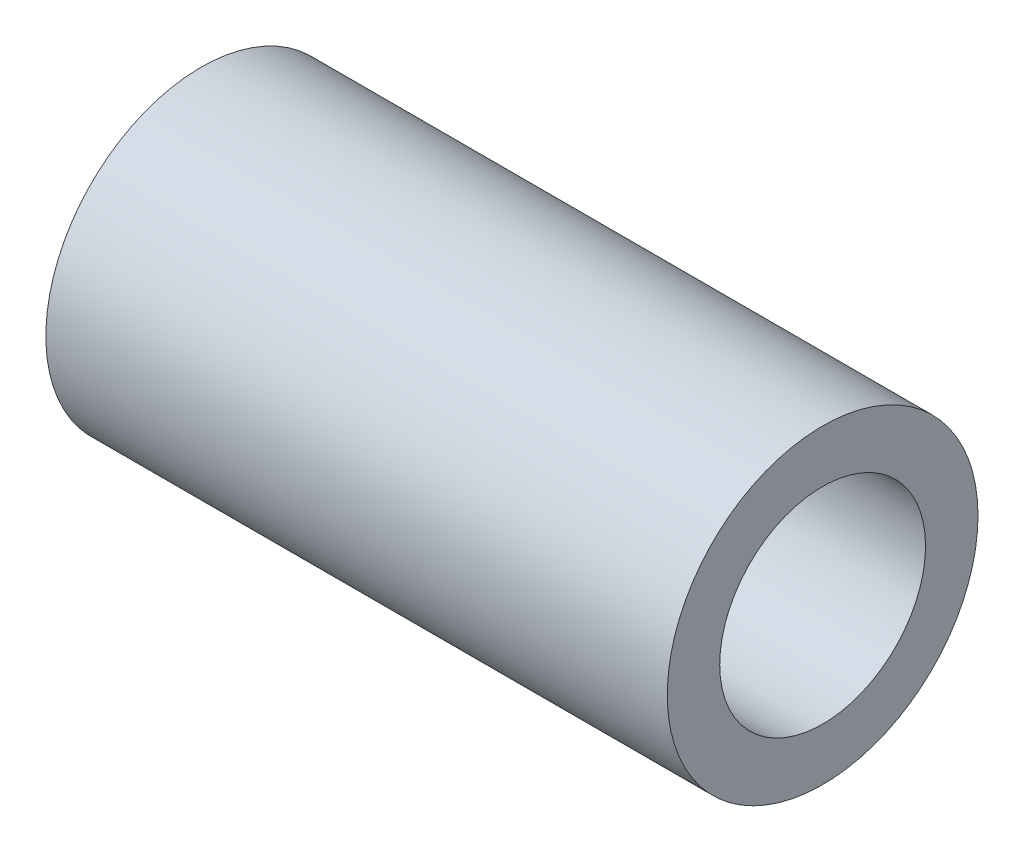
ISO-10303-21;
HEADER;
FILE_DESCRIPTION(('STEP AP214'),'2;1');
FILE_NAME('part.step','',(''),(''),'','','');
FILE_SCHEMA(('AUTOMOTIVE_DESIGN { 1 0 10303 214 1 1 1 1 }'));
ENDSEC;
DATA;
#1=APPLICATION_CONTEXT('core data for automotive mechanical design processes');
#2=APPLICATION_PROTOCOL_DEFINITION('international standard','automotive_design',2000,#1);
#3=PRODUCT_CONTEXT('',#1,'mechanical');
#4=PRODUCT('Part','Part','',(#3));
#5=PRODUCT_RELATED_PRODUCT_CATEGORY('part','',(#4));
#6=PRODUCT_DEFINITION_FORMATION('','',#4);
#7=PRODUCT_DEFINITION_CONTEXT('part definition',#1,'design');
#8=PRODUCT_DEFINITION('design','',#6,#7);
#9=PRODUCT_DEFINITION_SHAPE('','',#8);
#10=(LENGTH_UNIT() NAMED_UNIT(*) SI_UNIT(.MILLI.,.METRE.));
#11=(NAMED_UNIT(*) PLANE_ANGLE_UNIT() SI_UNIT($,.RADIAN.));
#12=(NAMED_UNIT(*) SI_UNIT($,.STERADIAN.) SOLID_ANGLE_UNIT());
#13=UNCERTAINTY_MEASURE_WITH_UNIT(LENGTH_MEASURE(1.E-05),#10,'distance_accuracy_value','');
#14=(GEOMETRIC_REPRESENTATION_CONTEXT(3) GLOBAL_UNCERTAINTY_ASSIGNED_CONTEXT((#13)) GLOBAL_UNIT_ASSIGNED_CONTEXT((#10,
#11,#12)) REPRESENTATION_CONTEXT('',''));
#15=CARTESIAN_POINT('',(0.,0.,0.));
#16=DIRECTION('',(0.,0.,1.));
#17=DIRECTION('',(1.,0.,0.));
#18=AXIS2_PLACEMENT_3D('',#15,#16,#17);
#19=CARTESIAN_POINT('',(16.,0.,0.));
#20=DIRECTION('',(1.,0.,0.));
#21=DIRECTION('',(0.,0.,-1.));
#22=AXIS2_PLACEMENT_3D('',#19,#20,#21);
#23=PLANE('',#22);
#24=CARTESIAN_POINT('',(16.,0.,0.));
#25=DIRECTION('',(1.,0.,0.));
#26=DIRECTION('',(0.,0.,-1.));
#27=AXIS2_PLACEMENT_3D('',#24,#25,#26);
#28=CIRCLE('',#27,4.);
#29=CARTESIAN_POINT('',(16.,0.,-4.));
#30=VERTEX_POINT('',#29);
#31=EDGE_CURVE('E10',#30,#30,#28,.T.);
#32=ORIENTED_EDGE('',*,*,#31,.T.);
#33=EDGE_LOOP('',(#32));
#34=FACE_BOUND('',#33,.T.);
#35=CARTESIAN_POINT('',(16.,0.,0.));
#36=DIRECTION('',(1.,0.,0.));
#37=DIRECTION('',(0.,0.,-1.));
#38=AXIS2_PLACEMENT_3D('',#35,#36,#37);
#39=CIRCLE('',#38,2.65);
#40=CARTESIAN_POINT('',(16.,0.,-2.65));
#41=VERTEX_POINT('',#40);
#42=EDGE_CURVE('E52',#41,#41,#39,.T.);
#43=ORIENTED_EDGE('',*,*,#42,.F.);
#44=EDGE_LOOP('',(#43));
#45=FACE_BOUND('',#44,.T.);
#46=ADVANCED_FACE('F41',(#34,#45),#23,.T.);
#47=CARTESIAN_POINT('',(0.,0.,0.));
#48=DIRECTION('',(1.,0.,0.));
#49=DIRECTION('',(0.,0.,-1.));
#50=AXIS2_PLACEMENT_3D('',#47,#48,#49);
#51=PLANE('',#50);
#52=CARTESIAN_POINT('',(0.,0.,0.));
#53=DIRECTION('',(1.,0.,0.));
#54=DIRECTION('',(0.,0.,-1.));
#55=AXIS2_PLACEMENT_3D('',#52,#53,#54);
#56=CIRCLE('',#55,4.);
#57=CARTESIAN_POINT('',(0.,0.,-4.));
#58=VERTEX_POINT('',#57);
#59=EDGE_CURVE('E45',#58,#58,#56,.T.);
#60=ORIENTED_EDGE('',*,*,#59,.F.);
#61=EDGE_LOOP('',(#60));
#62=FACE_BOUND('',#61,.T.);
#63=CARTESIAN_POINT('',(0.,0.,0.));
#64=DIRECTION('',(1.,0.,0.));
#65=DIRECTION('',(0.,0.,-1.));
#66=AXIS2_PLACEMENT_3D('',#63,#64,#65);
#67=CIRCLE('',#66,2.65);
#68=CARTESIAN_POINT('',(0.,0.,-2.65));
#69=VERTEX_POINT('',#68);
#70=EDGE_CURVE('E54',#69,#69,#67,.T.);
#71=ORIENTED_EDGE('',*,*,#70,.T.);
#72=EDGE_LOOP('',(#71));
#73=FACE_BOUND('',#72,.T.);
#74=ADVANCED_FACE('F64',(#62,#73),#51,.F.);
#75=CARTESIAN_POINT('',(16.,0.,0.));
#76=DIRECTION('',(-1.,0.,0.));
#77=DIRECTION('',(0.,0.,1.));
#78=AXIS2_PLACEMENT_3D('',#75,#76,#77);
#79=CYLINDRICAL_SURFACE('',#78,4.);
#80=ORIENTED_EDGE('',*,*,#31,.F.);
#81=EDGE_LOOP('',(#80));
#82=FACE_BOUND('',#81,.T.);
#83=ORIENTED_EDGE('',*,*,#59,.T.);
#84=EDGE_LOOP('',(#83));
#85=FACE_BOUND('',#84,.T.);
#86=ADVANCED_FACE('F43',(#82,#85),#79,.T.);
#87=CARTESIAN_POINT('',(16.,0.,0.));
#88=DIRECTION('',(-1.,0.,0.));
#89=DIRECTION('',(0.,0.,1.));
#90=AXIS2_PLACEMENT_3D('',#87,#88,#89);
#91=CYLINDRICAL_SURFACE('',#90,2.65);
#92=ORIENTED_EDGE('',*,*,#42,.T.);
#93=EDGE_LOOP('',(#92));
#94=FACE_BOUND('',#93,.T.);
#95=ORIENTED_EDGE('',*,*,#70,.F.);
#96=EDGE_LOOP('',(#95));
#97=FACE_BOUND('',#96,.T.);
#98=ADVANCED_FACE('F60',(#94,#97),#91,.F.);
#99=CLOSED_SHELL('',(#46,#74,#86,#98));
#100=MANIFOLD_SOLID_BREP('B2',#99);
#101=ADVANCED_BREP_SHAPE_REPRESENTATION('',(#18,#100),#14);
#102=SHAPE_DEFINITION_REPRESENTATION(#9,#101);
ENDSEC;
END-ISO-10303-21;
